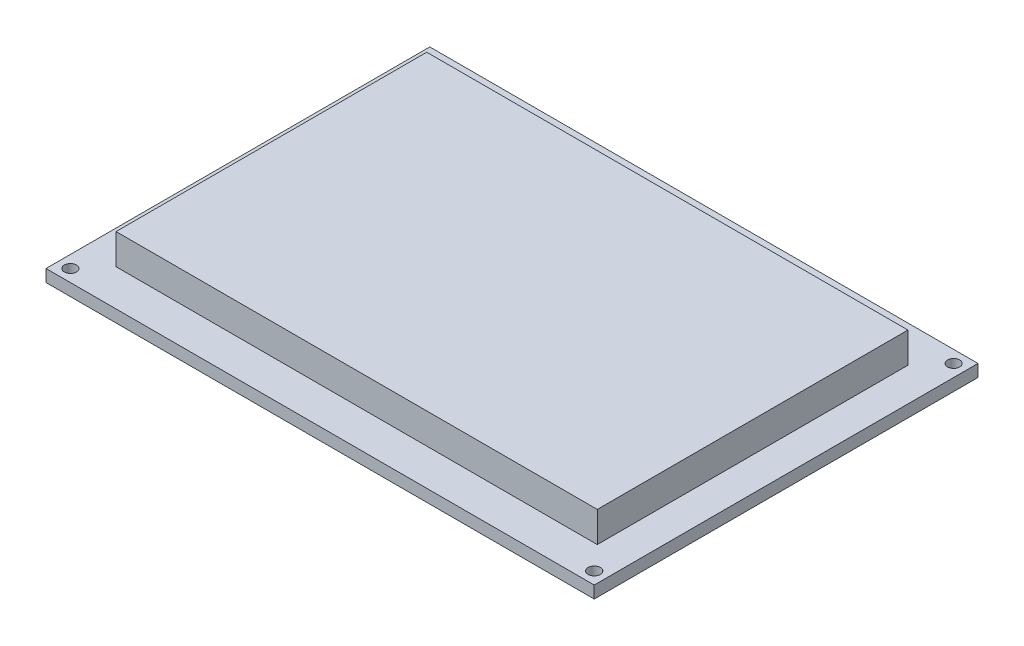
ISO-10303-21;
HEADER;
FILE_DESCRIPTION(('STEP AP214'),'2;1');
FILE_NAME('part.step','',(''),(''),'','','');
FILE_SCHEMA(('AUTOMOTIVE_DESIGN { 1 0 10303 214 1 1 1 1 }'));
ENDSEC;
DATA;
#1=APPLICATION_CONTEXT('core data for automotive mechanical design processes');
#2=APPLICATION_PROTOCOL_DEFINITION('international standard','automotive_design',2000,#1);
#3=PRODUCT_CONTEXT('',#1,'mechanical');
#4=PRODUCT('Part','Part','',(#3));
#5=PRODUCT_RELATED_PRODUCT_CATEGORY('part','',(#4));
#6=PRODUCT_DEFINITION_FORMATION('','',#4);
#7=PRODUCT_DEFINITION_CONTEXT('part definition',#1,'design');
#8=PRODUCT_DEFINITION('design','',#6,#7);
#9=PRODUCT_DEFINITION_SHAPE('','',#8);
#10=(LENGTH_UNIT() NAMED_UNIT(*) SI_UNIT(.MILLI.,.METRE.));
#11=(NAMED_UNIT(*) PLANE_ANGLE_UNIT() SI_UNIT($,.RADIAN.));
#12=(NAMED_UNIT(*) SI_UNIT($,.STERADIAN.) SOLID_ANGLE_UNIT());
#13=UNCERTAINTY_MEASURE_WITH_UNIT(LENGTH_MEASURE(1.E-05),#10,'distance_accuracy_value','');
#14=(GEOMETRIC_REPRESENTATION_CONTEXT(3) GLOBAL_UNCERTAINTY_ASSIGNED_CONTEXT((#13)) GLOBAL_UNIT_ASSIGNED_CONTEXT((#10,
#11,#12)) REPRESENTATION_CONTEXT('',''));
#15=CARTESIAN_POINT('',(0.,0.,0.));
#16=DIRECTION('',(0.,0.,1.));
#17=DIRECTION('',(1.,0.,0.));
#18=AXIS2_PLACEMENT_3D('',#15,#16,#17);
#19=CARTESIAN_POINT('',(-30.1209677419355,2.,-18.5181451612903));
#20=DIRECTION('',(1.,0.,0.));
#21=DIRECTION('',(0.,0.,-1.));
#22=AXIS2_PLACEMENT_3D('',#19,#20,#21);
#23=PLANE('',#22);
#24=DIRECTION('',(0.,0.,1.));
#25=VECTOR('',#24,1.);
#26=CARTESIAN_POINT('',(-30.1209677419355,0.,-18.5181451612903));
#27=LINE('',#26,#25);
#28=CARTESIAN_POINT('',(-30.1209677419355,0.,-18.5181451612903));
#29=VERTEX_POINT('',#28);
#30=CARTESIAN_POINT('',(-30.1209677419355,0.,44.4818548387097));
#31=VERTEX_POINT('',#30);
#32=EDGE_CURVE('E127',#29,#31,#27,.T.);
#33=ORIENTED_EDGE('',*,*,#32,.T.);
#34=DIRECTION('',(0.,-1.,0.));
#35=VECTOR('',#34,1.);
#36=CARTESIAN_POINT('',(-30.1209677419355,2.,44.4818548387097));
#37=LINE('',#36,#35);
#38=CARTESIAN_POINT('',(-30.1209677419355,2.,44.4818548387097));
#39=VERTEX_POINT('',#38);
#40=EDGE_CURVE('E11',#39,#31,#37,.T.);
#41=ORIENTED_EDGE('',*,*,#40,.F.);
#42=DIRECTION('',(0.,0.,1.));
#43=VECTOR('',#42,1.);
#44=CARTESIAN_POINT('',(-30.1209677419355,2.,-18.5181451612903));
#45=LINE('',#44,#43);
#46=CARTESIAN_POINT('',(-30.1209677419355,2.,-18.5181451612903));
#47=VERTEX_POINT('',#46);
#48=EDGE_CURVE('E138',#47,#39,#45,.T.);
#49=ORIENTED_EDGE('',*,*,#48,.F.);
#50=DIRECTION('',(0.,-1.,0.));
#51=VECTOR('',#50,1.);
#52=CARTESIAN_POINT('',(-30.1209677419355,2.,-18.5181451612903));
#53=LINE('',#52,#51);
#54=EDGE_CURVE('E151',#47,#29,#53,.T.);
#55=ORIENTED_EDGE('',*,*,#54,.T.);
#56=EDGE_LOOP('',(#33,#41,#49,#55));
#57=FACE_BOUND('',#56,.T.);
#58=ADVANCED_FACE('F39',(#57),#23,.F.);
#59=CARTESIAN_POINT('',(-30.1209677419355,2.,44.4818548387097));
#60=DIRECTION('',(0.,0.,-1.));
#61=DIRECTION('',(-1.,0.,0.));
#62=AXIS2_PLACEMENT_3D('',#59,#60,#61);
#63=PLANE('',#62);
#64=DIRECTION('',(1.,0.,0.));
#65=VECTOR('',#64,1.);
#66=CARTESIAN_POINT('',(-30.1209677419355,0.,44.4818548387097));
#67=LINE('',#66,#65);
#68=CARTESIAN_POINT('',(59.8790322580645,0.,44.4818548387097));
#69=VERTEX_POINT('',#68);
#70=EDGE_CURVE('E132',#31,#69,#67,.T.);
#71=ORIENTED_EDGE('',*,*,#70,.T.);
#72=DIRECTION('',(0.,-1.,0.));
#73=VECTOR('',#72,1.);
#74=CARTESIAN_POINT('',(59.8790322580645,2.,44.4818548387097));
#75=LINE('',#74,#73);
#76=CARTESIAN_POINT('',(59.8790322580645,2.,44.4818548387097));
#77=VERTEX_POINT('',#76);
#78=EDGE_CURVE('E47',#77,#69,#75,.T.);
#79=ORIENTED_EDGE('',*,*,#78,.F.);
#80=DIRECTION('',(1.,0.,0.));
#81=VECTOR('',#80,1.);
#82=CARTESIAN_POINT('',(-30.1209677419355,2.,44.4818548387097));
#83=LINE('',#82,#81);
#84=EDGE_CURVE('E142',#39,#77,#83,.T.);
#85=ORIENTED_EDGE('',*,*,#84,.F.);
#86=ORIENTED_EDGE('',*,*,#40,.T.);
#87=EDGE_LOOP('',(#71,#79,#85,#86));
#88=FACE_BOUND('',#87,.T.);
#89=ADVANCED_FACE('F188',(#88),#63,.F.);
#90=CARTESIAN_POINT('',(59.8790322580645,2.,-18.5181451612903));
#91=DIRECTION('',(-1.,0.,0.));
#92=DIRECTION('',(0.,0.,1.));
#93=AXIS2_PLACEMENT_3D('',#90,#91,#92);
#94=PLANE('',#93);
#95=DIRECTION('',(0.,0.,-1.));
#96=VECTOR('',#95,1.);
#97=CARTESIAN_POINT('',(59.8790322580645,0.,-18.5181451612903));
#98=LINE('',#97,#96);
#99=CARTESIAN_POINT('',(59.8790322580645,0.,-18.5181451612903));
#100=VERTEX_POINT('',#99);
#101=EDGE_CURVE('E155',#69,#100,#98,.T.);
#102=ORIENTED_EDGE('',*,*,#101,.T.);
#103=DIRECTION('',(0.,-1.,0.));
#104=VECTOR('',#103,1.);
#105=CARTESIAN_POINT('',(59.8790322580645,2.,-18.5181451612903));
#106=LINE('',#105,#104);
#107=CARTESIAN_POINT('',(59.8790322580645,2.,-18.5181451612903));
#108=VERTEX_POINT('',#107);
#109=EDGE_CURVE('E163',#108,#100,#106,.T.);
#110=ORIENTED_EDGE('',*,*,#109,.F.);
#111=DIRECTION('',(0.,0.,-1.));
#112=VECTOR('',#111,1.);
#113=CARTESIAN_POINT('',(59.8790322580645,2.,-18.5181451612903));
#114=LINE('',#113,#112);
#115=EDGE_CURVE('E146',#77,#108,#114,.T.);
#116=ORIENTED_EDGE('',*,*,#115,.F.);
#117=ORIENTED_EDGE('',*,*,#78,.T.);
#118=EDGE_LOOP('',(#102,#110,#116,#117));
#119=FACE_BOUND('',#118,.T.);
#120=ADVANCED_FACE('F172',(#119),#94,.F.);
#121=CARTESIAN_POINT('',(-30.1209677419355,2.,-18.5181451612903));
#122=DIRECTION('',(0.,0.,1.));
#123=DIRECTION('',(1.,0.,0.));
#124=AXIS2_PLACEMENT_3D('',#121,#122,#123);
#125=PLANE('',#124);
#126=DIRECTION('',(-1.,0.,0.));
#127=VECTOR('',#126,1.);
#128=CARTESIAN_POINT('',(-30.1209677419355,0.,-18.5181451612903));
#129=LINE('',#128,#127);
#130=EDGE_CURVE('E143',#100,#29,#129,.T.);
#131=ORIENTED_EDGE('',*,*,#130,.T.);
#132=ORIENTED_EDGE('',*,*,#54,.F.);
#133=DIRECTION('',(-1.,0.,0.));
#134=VECTOR('',#133,1.);
#135=CARTESIAN_POINT('',(-30.1209677419355,2.,-18.5181451612903));
#136=LINE('',#135,#134);
#137=EDGE_CURVE('E149',#108,#47,#136,.T.);
#138=ORIENTED_EDGE('',*,*,#137,.F.);
#139=ORIENTED_EDGE('',*,*,#109,.T.);
#140=EDGE_LOOP('',(#131,#132,#138,#139));
#141=FACE_BOUND('',#140,.T.);
#142=ADVANCED_FACE('F181',(#141),#125,.F.);
#143=CARTESIAN_POINT('',(0.,2.,0.));
#144=DIRECTION('',(0.,1.,0.));
#145=DIRECTION('',(0.,0.,1.));
#146=AXIS2_PLACEMENT_3D('',#143,#144,#145);
#147=PLANE('',#146);
#148=CARTESIAN_POINT('',(57.8790322580645,2.,-16.5181451612903));
#149=DIRECTION('',(0.,1.,0.));
#150=DIRECTION('',(0.,0.,1.));
#151=AXIS2_PLACEMENT_3D('',#148,#149,#150);
#152=CIRCLE('',#151,0.999999999999998);
#153=CARTESIAN_POINT('',(57.8790322580645,2.,-15.5181451612903));
#154=VERTEX_POINT('',#153);
#155=EDGE_CURVE('E261',#154,#154,#152,.T.);
#156=ORIENTED_EDGE('',*,*,#155,.F.);
#157=EDGE_LOOP('',(#156));
#158=FACE_BOUND('',#157,.T.);
#159=CARTESIAN_POINT('',(57.8790322580645,2.,42.4818548387097));
#160=DIRECTION('',(0.,1.,0.));
#161=DIRECTION('',(0.,0.,1.));
#162=AXIS2_PLACEMENT_3D('',#159,#160,#161);
#163=CIRCLE('',#162,0.999999999999998);
#164=CARTESIAN_POINT('',(57.8790322580645,2.,43.4818548387097));
#165=VERTEX_POINT('',#164);
#166=EDGE_CURVE('E251',#165,#165,#163,.T.);
#167=ORIENTED_EDGE('',*,*,#166,.F.);
#168=EDGE_LOOP('',(#167));
#169=FACE_BOUND('',#168,.T.);
#170=CARTESIAN_POINT('',(-28.1209677419355,2.,42.4818548387097));
#171=DIRECTION('',(0.,1.,0.));
#172=DIRECTION('',(0.,0.,1.));
#173=AXIS2_PLACEMENT_3D('',#170,#171,#172);
#174=CIRCLE('',#173,1.);
#175=CARTESIAN_POINT('',(-28.1209677419355,2.,43.4818548387097));
#176=VERTEX_POINT('',#175);
#177=EDGE_CURVE('E241',#176,#176,#174,.T.);
#178=ORIENTED_EDGE('',*,*,#177,.F.);
#179=EDGE_LOOP('',(#178));
#180=FACE_BOUND('',#179,.T.);
#181=CARTESIAN_POINT('',(-28.1209677419355,2.,-16.5181451612903));
#182=DIRECTION('',(0.,1.,0.));
#183=DIRECTION('',(0.,0.,1.));
#184=AXIS2_PLACEMENT_3D('',#181,#182,#183);
#185=CIRCLE('',#184,1.);
#186=CARTESIAN_POINT('',(-28.1209677419355,2.,-15.5181451612903));
#187=VERTEX_POINT('',#186);
#188=EDGE_CURVE('E248',#187,#187,#185,.T.);
#189=ORIENTED_EDGE('',*,*,#188,.F.);
#190=EDGE_LOOP('',(#189));
#191=FACE_BOUND('',#190,.T.);
#192=DIRECTION('',(0.,0.,-1.));
#193=VECTOR('',#192,1.);
#194=CARTESIAN_POINT('',(54.3790322580645,2.,-12.5181451612903));
#195=LINE('',#194,#193);
#196=CARTESIAN_POINT('',(54.3790322580645,2.,38.4818548387097));
#197=VERTEX_POINT('',#196);
#198=CARTESIAN_POINT('',(54.3790322580645,2.,-12.5181451612903));
#199=VERTEX_POINT('',#198);
#200=EDGE_CURVE('E54',#197,#199,#195,.T.);
#201=ORIENTED_EDGE('',*,*,#200,.F.);
#202=DIRECTION('',(1.,0.,0.));
#203=VECTOR('',#202,1.);
#204=CARTESIAN_POINT('',(-24.6209677419355,2.,38.4818548387097));
#205=LINE('',#204,#203);
#206=CARTESIAN_POINT('',(-24.6209677419355,2.,38.4818548387097));
#207=VERTEX_POINT('',#206);
#208=EDGE_CURVE('E58',#207,#197,#205,.T.);
#209=ORIENTED_EDGE('',*,*,#208,.F.);
#210=DIRECTION('',(0.,0.,1.));
#211=VECTOR('',#210,1.);
#212=CARTESIAN_POINT('',(-24.6209677419355,2.,-12.5181451612903));
#213=LINE('',#212,#211);
#214=CARTESIAN_POINT('',(-24.6209677419355,2.,-12.5181451612903));
#215=VERTEX_POINT('',#214);
#216=EDGE_CURVE('E282',#215,#207,#213,.T.);
#217=ORIENTED_EDGE('',*,*,#216,.F.);
#218=DIRECTION('',(-1.,0.,0.));
#219=VECTOR('',#218,1.);
#220=CARTESIAN_POINT('',(-24.6209677419355,2.,-12.5181451612903));
#221=LINE('',#220,#219);
#222=EDGE_CURVE('E279',#199,#215,#221,.T.);
#223=ORIENTED_EDGE('',*,*,#222,.F.);
#224=EDGE_LOOP('',(#201,#209,#217,#223));
#225=FACE_BOUND('',#224,.T.);
#226=ORIENTED_EDGE('',*,*,#48,.T.);
#227=ORIENTED_EDGE('',*,*,#84,.T.);
#228=ORIENTED_EDGE('',*,*,#115,.T.);
#229=ORIENTED_EDGE('',*,*,#137,.T.);
#230=EDGE_LOOP('',(#226,#227,#228,#229));
#231=FACE_BOUND('',#230,.T.);
#232=ADVANCED_FACE('F187',(#158,#169,#180,#191,#225,#231),#147,.T.);
#233=CARTESIAN_POINT('',(0.,0.,0.));
#234=DIRECTION('',(0.,1.,0.));
#235=DIRECTION('',(0.,0.,1.));
#236=AXIS2_PLACEMENT_3D('',#233,#234,#235);
#237=PLANE('',#236);
#238=CARTESIAN_POINT('',(57.8790322580645,0.,-16.5181451612903));
#239=DIRECTION('',(0.,1.,0.));
#240=DIRECTION('',(0.,0.,1.));
#241=AXIS2_PLACEMENT_3D('',#238,#239,#240);
#242=CIRCLE('',#241,0.999999999999998);
#243=CARTESIAN_POINT('',(57.8790322580645,0.,-15.5181451612903));
#244=VERTEX_POINT('',#243);
#245=EDGE_CURVE('E257',#244,#244,#242,.T.);
#246=ORIENTED_EDGE('',*,*,#245,.T.);
#247=EDGE_LOOP('',(#246));
#248=FACE_BOUND('',#247,.T.);
#249=CARTESIAN_POINT('',(57.8790322580645,0.,42.4818548387097));
#250=DIRECTION('',(0.,1.,0.));
#251=DIRECTION('',(0.,0.,1.));
#252=AXIS2_PLACEMENT_3D('',#249,#250,#251);
#253=CIRCLE('',#252,0.999999999999998);
#254=CARTESIAN_POINT('',(57.8790322580645,0.,43.4818548387097));
#255=VERTEX_POINT('',#254);
#256=EDGE_CURVE('E244',#255,#255,#253,.T.);
#257=ORIENTED_EDGE('',*,*,#256,.T.);
#258=EDGE_LOOP('',(#257));
#259=FACE_BOUND('',#258,.T.);
#260=CARTESIAN_POINT('',(-28.1209677419355,0.,42.4818548387097));
#261=DIRECTION('',(0.,1.,0.));
#262=DIRECTION('',(0.,0.,1.));
#263=AXIS2_PLACEMENT_3D('',#260,#261,#262);
#264=CIRCLE('',#263,1.);
#265=CARTESIAN_POINT('',(-28.1209677419355,0.,43.4818548387097));
#266=VERTEX_POINT('',#265);
#267=EDGE_CURVE('E238',#266,#266,#264,.T.);
#268=ORIENTED_EDGE('',*,*,#267,.T.);
#269=EDGE_LOOP('',(#268));
#270=FACE_BOUND('',#269,.T.);
#271=CARTESIAN_POINT('',(-28.1209677419355,0.,-16.5181451612903));
#272=DIRECTION('',(0.,1.,0.));
#273=DIRECTION('',(0.,0.,1.));
#274=AXIS2_PLACEMENT_3D('',#271,#272,#273);
#275=CIRCLE('',#274,1.);
#276=CARTESIAN_POINT('',(-28.1209677419355,0.,-15.5181451612903));
#277=VERTEX_POINT('',#276);
#278=EDGE_CURVE('E265',#277,#277,#275,.T.);
#279=ORIENTED_EDGE('',*,*,#278,.T.);
#280=EDGE_LOOP('',(#279));
#281=FACE_BOUND('',#280,.T.);
#282=ORIENTED_EDGE('',*,*,#32,.F.);
#283=ORIENTED_EDGE('',*,*,#130,.F.);
#284=ORIENTED_EDGE('',*,*,#101,.F.);
#285=ORIENTED_EDGE('',*,*,#70,.F.);
#286=EDGE_LOOP('',(#282,#283,#284,#285));
#287=FACE_BOUND('',#286,.T.);
#288=ADVANCED_FACE('F178',(#248,#259,#270,#281,#287),#237,.F.);
#289=CARTESIAN_POINT('',(54.3790322580645,7.,-12.5181451612903));
#290=DIRECTION('',(-1.,0.,0.));
#291=DIRECTION('',(0.,0.,1.));
#292=AXIS2_PLACEMENT_3D('',#289,#290,#291);
#293=PLANE('',#292);
#294=ORIENTED_EDGE('',*,*,#200,.T.);
#295=DIRECTION('',(0.,-1.,0.));
#296=VECTOR('',#295,1.);
#297=CARTESIAN_POINT('',(54.3790322580645,7.,-12.5181451612903));
#298=LINE('',#297,#296);
#299=CARTESIAN_POINT('',(54.3790322580645,7.,-12.5181451612903));
#300=VERTEX_POINT('',#299);
#301=EDGE_CURVE('E107',#300,#199,#298,.T.);
#302=ORIENTED_EDGE('',*,*,#301,.F.);
#303=DIRECTION('',(0.,0.,-1.));
#304=VECTOR('',#303,1.);
#305=CARTESIAN_POINT('',(54.3790322580645,7.,-12.5181451612903));
#306=LINE('',#305,#304);
#307=CARTESIAN_POINT('',(54.3790322580645,7.,38.4818548387097));
#308=VERTEX_POINT('',#307);
#309=EDGE_CURVE('E114',#308,#300,#306,.T.);
#310=ORIENTED_EDGE('',*,*,#309,.F.);
#311=DIRECTION('',(0.,-1.,0.));
#312=VECTOR('',#311,1.);
#313=CARTESIAN_POINT('',(54.3790322580645,7.,38.4818548387097));
#314=LINE('',#313,#312);
#315=EDGE_CURVE('E276',#308,#197,#314,.T.);
#316=ORIENTED_EDGE('',*,*,#315,.T.);
#317=EDGE_LOOP('',(#294,#302,#310,#316));
#318=FACE_BOUND('',#317,.T.);
#319=ADVANCED_FACE('F125',(#318),#293,.F.);
#320=CARTESIAN_POINT('',(-24.6209677419355,7.,-12.5181451612903));
#321=DIRECTION('',(0.,0.,1.));
#322=DIRECTION('',(1.,0.,0.));
#323=AXIS2_PLACEMENT_3D('',#320,#321,#322);
#324=PLANE('',#323);
#325=ORIENTED_EDGE('',*,*,#222,.T.);
#326=DIRECTION('',(0.,-1.,0.));
#327=VECTOR('',#326,1.);
#328=CARTESIAN_POINT('',(-24.6209677419355,7.,-12.5181451612903));
#329=LINE('',#328,#327);
#330=CARTESIAN_POINT('',(-24.6209677419355,7.,-12.5181451612903));
#331=VERTEX_POINT('',#330);
#332=EDGE_CURVE('E109',#331,#215,#329,.T.);
#333=ORIENTED_EDGE('',*,*,#332,.F.);
#334=DIRECTION('',(-1.,0.,0.));
#335=VECTOR('',#334,1.);
#336=CARTESIAN_POINT('',(-24.6209677419355,7.,-12.5181451612903));
#337=LINE('',#336,#335);
#338=EDGE_CURVE('E102',#300,#331,#337,.T.);
#339=ORIENTED_EDGE('',*,*,#338,.F.);
#340=ORIENTED_EDGE('',*,*,#301,.T.);
#341=EDGE_LOOP('',(#325,#333,#339,#340));
#342=FACE_BOUND('',#341,.T.);
#343=ADVANCED_FACE('F105',(#342),#324,.F.);
#344=CARTESIAN_POINT('',(-24.6209677419355,7.,-12.5181451612903));
#345=DIRECTION('',(1.,0.,0.));
#346=DIRECTION('',(0.,0.,-1.));
#347=AXIS2_PLACEMENT_3D('',#344,#345,#346);
#348=PLANE('',#347);
#349=ORIENTED_EDGE('',*,*,#216,.T.);
#350=DIRECTION('',(0.,-1.,0.));
#351=VECTOR('',#350,1.);
#352=CARTESIAN_POINT('',(-24.6209677419355,7.,38.4818548387097));
#353=LINE('',#352,#351);
#354=CARTESIAN_POINT('',(-24.6209677419355,7.,38.4818548387097));
#355=VERTEX_POINT('',#354);
#356=EDGE_CURVE('E134',#355,#207,#353,.T.);
#357=ORIENTED_EDGE('',*,*,#356,.F.);
#358=DIRECTION('',(0.,0.,1.));
#359=VECTOR('',#358,1.);
#360=CARTESIAN_POINT('',(-24.6209677419355,7.,-12.5181451612903));
#361=LINE('',#360,#359);
#362=EDGE_CURVE('E113',#331,#355,#361,.T.);
#363=ORIENTED_EDGE('',*,*,#362,.F.);
#364=ORIENTED_EDGE('',*,*,#332,.T.);
#365=EDGE_LOOP('',(#349,#357,#363,#364));
#366=FACE_BOUND('',#365,.T.);
#367=ADVANCED_FACE('F208',(#366),#348,.F.);
#368=CARTESIAN_POINT('',(-24.6209677419355,7.,38.4818548387097));
#369=DIRECTION('',(0.,0.,-1.));
#370=DIRECTION('',(-1.,0.,0.));
#371=AXIS2_PLACEMENT_3D('',#368,#369,#370);
#372=PLANE('',#371);
#373=ORIENTED_EDGE('',*,*,#208,.T.);
#374=ORIENTED_EDGE('',*,*,#315,.F.);
#375=DIRECTION('',(1.,0.,0.));
#376=VECTOR('',#375,1.);
#377=CARTESIAN_POINT('',(-24.6209677419355,7.,38.4818548387097));
#378=LINE('',#377,#376);
#379=EDGE_CURVE('E119',#355,#308,#378,.T.);
#380=ORIENTED_EDGE('',*,*,#379,.F.);
#381=ORIENTED_EDGE('',*,*,#356,.T.);
#382=EDGE_LOOP('',(#373,#374,#380,#381));
#383=FACE_BOUND('',#382,.T.);
#384=ADVANCED_FACE('F211',(#383),#372,.F.);
#385=CARTESIAN_POINT('',(0.,7.,0.));
#386=DIRECTION('',(0.,1.,0.));
#387=DIRECTION('',(0.,0.,1.));
#388=AXIS2_PLACEMENT_3D('',#385,#386,#387);
#389=PLANE('',#388);
#390=ORIENTED_EDGE('',*,*,#309,.T.);
#391=ORIENTED_EDGE('',*,*,#338,.T.);
#392=ORIENTED_EDGE('',*,*,#362,.T.);
#393=ORIENTED_EDGE('',*,*,#379,.T.);
#394=EDGE_LOOP('',(#390,#391,#392,#393));
#395=FACE_BOUND('',#394,.T.);
#396=ADVANCED_FACE('F117',(#395),#389,.T.);
#397=CARTESIAN_POINT('',(-28.1209677419355,0.,-16.5181451612903));
#398=DIRECTION('',(0.,1.,0.));
#399=DIRECTION('',(0.,0.,1.));
#400=AXIS2_PLACEMENT_3D('',#397,#398,#399);
#401=CYLINDRICAL_SURFACE('',#400,1.);
#402=ORIENTED_EDGE('',*,*,#278,.F.);
#403=EDGE_LOOP('',(#402));
#404=FACE_BOUND('',#403,.T.);
#405=ORIENTED_EDGE('',*,*,#188,.T.);
#406=EDGE_LOOP('',(#405));
#407=FACE_BOUND('',#406,.T.);
#408=ADVANCED_FACE('F218',(#404,#407),#401,.F.);
#409=CARTESIAN_POINT('',(-28.1209677419355,0.,42.4818548387097));
#410=DIRECTION('',(0.,1.,0.));
#411=DIRECTION('',(0.,0.,1.));
#412=AXIS2_PLACEMENT_3D('',#409,#410,#411);
#413=CYLINDRICAL_SURFACE('',#412,1.);
#414=ORIENTED_EDGE('',*,*,#267,.F.);
#415=EDGE_LOOP('',(#414));
#416=FACE_BOUND('',#415,.T.);
#417=ORIENTED_EDGE('',*,*,#177,.T.);
#418=EDGE_LOOP('',(#417));
#419=FACE_BOUND('',#418,.T.);
#420=ADVANCED_FACE('F221',(#416,#419),#413,.F.);
#421=CARTESIAN_POINT('',(57.8790322580645,0.,42.4818548387097));
#422=DIRECTION('',(0.,1.,0.));
#423=DIRECTION('',(0.,0.,1.));
#424=AXIS2_PLACEMENT_3D('',#421,#422,#423);
#425=CYLINDRICAL_SURFACE('',#424,0.999999999999998);
#426=ORIENTED_EDGE('',*,*,#256,.F.);
#427=EDGE_LOOP('',(#426));
#428=FACE_BOUND('',#427,.T.);
#429=ORIENTED_EDGE('',*,*,#166,.T.);
#430=EDGE_LOOP('',(#429));
#431=FACE_BOUND('',#430,.T.);
#432=ADVANCED_FACE('F226',(#428,#431),#425,.F.);
#433=CARTESIAN_POINT('',(57.8790322580645,0.,-16.5181451612903));
#434=DIRECTION('',(0.,1.,0.));
#435=DIRECTION('',(0.,0.,1.));
#436=AXIS2_PLACEMENT_3D('',#433,#434,#435);
#437=CYLINDRICAL_SURFACE('',#436,0.999999999999998);
#438=ORIENTED_EDGE('',*,*,#245,.F.);
#439=EDGE_LOOP('',(#438));
#440=FACE_BOUND('',#439,.T.);
#441=ORIENTED_EDGE('',*,*,#155,.T.);
#442=EDGE_LOOP('',(#441));
#443=FACE_BOUND('',#442,.T.);
#444=ADVANCED_FACE('F223',(#440,#443),#437,.F.);
#445=CLOSED_SHELL('',(#58,#89,#120,#142,#232,#288,#319,#343,#367,#384,#396,#408,#420,#432,#444));
#446=MANIFOLD_SOLID_BREP('B2',#445);
#447=ADVANCED_BREP_SHAPE_REPRESENTATION('',(#18,#446),#14);
#448=SHAPE_DEFINITION_REPRESENTATION(#9,#447);
ENDSEC;
END-ISO-10303-21;
